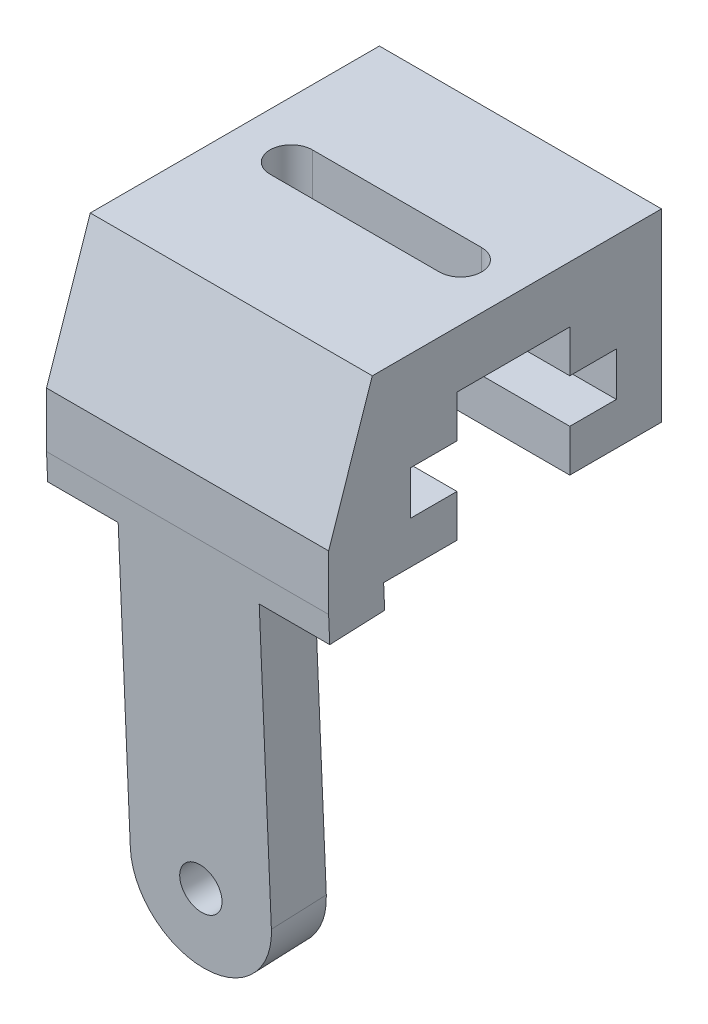
ISO-10303-21;
HEADER;
FILE_DESCRIPTION(('STEP AP214'),'2;1');
FILE_NAME('part.step','',(''),(''),'','','');
FILE_SCHEMA(('AUTOMOTIVE_DESIGN { 1 0 10303 214 1 1 1 1 }'));
ENDSEC;
DATA;
#1=APPLICATION_CONTEXT('core data for automotive mechanical design processes');
#2=APPLICATION_PROTOCOL_DEFINITION('international standard','automotive_design',2000,#1);
#3=PRODUCT_CONTEXT('',#1,'mechanical');
#4=PRODUCT('Part','Part','',(#3));
#5=PRODUCT_RELATED_PRODUCT_CATEGORY('part','',(#4));
#6=PRODUCT_DEFINITION_FORMATION('','',#4);
#7=PRODUCT_DEFINITION_CONTEXT('part definition',#1,'design');
#8=PRODUCT_DEFINITION('design','',#6,#7);
#9=PRODUCT_DEFINITION_SHAPE('','',#8);
#10=(LENGTH_UNIT() NAMED_UNIT(*) SI_UNIT(.MILLI.,.METRE.));
#11=(NAMED_UNIT(*) PLANE_ANGLE_UNIT() SI_UNIT($,.RADIAN.));
#12=(NAMED_UNIT(*) SI_UNIT($,.STERADIAN.) SOLID_ANGLE_UNIT());
#13=UNCERTAINTY_MEASURE_WITH_UNIT(LENGTH_MEASURE(1.E-05),#10,'distance_accuracy_value','');
#14=(GEOMETRIC_REPRESENTATION_CONTEXT(3) GLOBAL_UNCERTAINTY_ASSIGNED_CONTEXT((#13)) GLOBAL_UNIT_ASSIGNED_CONTEXT((#10,
#11,#12)) REPRESENTATION_CONTEXT('',''));
#15=CARTESIAN_POINT('',(0.,0.,0.));
#16=DIRECTION('',(0.,0.,1.));
#17=DIRECTION('',(1.,0.,0.));
#18=AXIS2_PLACEMENT_3D('',#15,#16,#17);
#19=CARTESIAN_POINT('',(10.,0.0103965592488447,-0.246061748106842));
#20=DIRECTION('',(0.,0.0422141664742495,-0.999108584763881));
#21=DIRECTION('',(0.,0.999108584763881,0.0422141664742495));
#22=AXIS2_PLACEMENT_3D('',#19,#20,#21);
#23=PLANE('',#22);
#24=CARTESIAN_POINT('',(0.,-35.2399685853006,-1.73545419771908));
#25=DIRECTION('',(0.,0.0422141664742495,-0.999108584763881));
#26=DIRECTION('',(0.,0.999108584763881,0.0422141664742495));
#27=AXIS2_PLACEMENT_3D('',#24,#25,#26);
#28=CIRCLE('',#27,5.);
#29=CARTESIAN_POINT('',(5.,-35.2399685853006,-1.73545419771908));
#30=VERTEX_POINT('',#29);
#31=CARTESIAN_POINT('',(0.,-40.23551150912,-1.94652503009033));
#32=VERTEX_POINT('',#31);
#33=EDGE_CURVE('E289',#30,#32,#28,.T.);
#34=ORIENTED_EDGE('',*,*,#33,.T.);
#35=CARTESIAN_POINT('',(0.,-35.2399685853006,-1.73545419771908));
#36=DIRECTION('',(0.,0.0422141664742495,-0.999108584763881));
#37=DIRECTION('',(0.,0.999108584763881,0.0422141664742495));
#38=AXIS2_PLACEMENT_3D('',#35,#36,#37);
#39=CIRCLE('',#38,5.);
#40=CARTESIAN_POINT('',(-5.,-35.2399685853006,-1.73545419771908));
#41=VERTEX_POINT('',#40);
#42=EDGE_CURVE('E44',#32,#41,#39,.T.);
#43=ORIENTED_EDGE('',*,*,#42,.T.);
#44=DIRECTION('',(0.,-0.999108584763881,-0.0422141664742495));
#45=VECTOR('',#44,1.);
#46=CARTESIAN_POINT('',(-5.,0.0103965592488447,-0.246061748106842));
#47=LINE('',#46,#45);
#48=CARTESIAN_POINT('',(-5.,-14.83551150912,-0.873328537939938));
#49=VERTEX_POINT('',#48);
#50=EDGE_CURVE('E292',#49,#41,#47,.T.);
#51=ORIENTED_EDGE('',*,*,#50,.F.);
#52=DIRECTION('',(-1.,0.,0.));
#53=VECTOR('',#52,1.);
#54=CARTESIAN_POINT('',(10.,-14.83551150912,-0.873328537939938));
#55=LINE('',#54,#53);
#56=CARTESIAN_POINT('',(-10.,-14.83551150912,-0.873328537939938));
#57=VERTEX_POINT('',#56);
#58=EDGE_CURVE('E326',#49,#57,#55,.T.);
#59=ORIENTED_EDGE('',*,*,#58,.T.);
#60=DIRECTION('',(0.,-0.999108584763881,-0.0422141664742495));
#61=VECTOR('',#60,1.);
#62=CARTESIAN_POINT('',(-10.,0.0103965592488447,-0.246061748106842));
#63=LINE('',#62,#61);
#64=CARTESIAN_POINT('',(-10.,-13.1,-0.800000000000008));
#65=VERTEX_POINT('',#64);
#66=EDGE_CURVE('E329',#65,#57,#63,.T.);
#67=ORIENTED_EDGE('',*,*,#66,.F.);
#68=DIRECTION('',(-1.,0.,0.));
#69=VECTOR('',#68,1.);
#70=CARTESIAN_POINT('',(10.,-13.1,-0.800000000000008));
#71=LINE('',#70,#69);
#72=CARTESIAN_POINT('',(10.,-13.1,-0.800000000000008));
#73=VERTEX_POINT('',#72);
#74=EDGE_CURVE('E332',#73,#65,#71,.T.);
#75=ORIENTED_EDGE('',*,*,#74,.F.);
#76=DIRECTION('',(0.,-0.999108584763881,-0.0422141664742495));
#77=VECTOR('',#76,1.);
#78=CARTESIAN_POINT('',(10.,0.0103965592488447,-0.246061748106842));
#79=LINE('',#78,#77);
#80=CARTESIAN_POINT('',(10.,-14.83551150912,-0.873328537939938));
#81=VERTEX_POINT('',#80);
#82=EDGE_CURVE('E542',#73,#81,#79,.T.);
#83=ORIENTED_EDGE('',*,*,#82,.T.);
#84=CARTESIAN_POINT('',(5.,-14.83551150912,-0.873328537939938));
#85=VERTEX_POINT('',#84);
#86=EDGE_CURVE('E319',#81,#85,#55,.T.);
#87=ORIENTED_EDGE('',*,*,#86,.T.);
#88=DIRECTION('',(0.,-0.999108584763881,-0.0422141664742495));
#89=VECTOR('',#88,1.);
#90=CARTESIAN_POINT('',(5.,0.0103965592488447,-0.246061748106842));
#91=LINE('',#90,#89);
#92=EDGE_CURVE('E272',#85,#30,#91,.T.);
#93=ORIENTED_EDGE('',*,*,#92,.T.);
#94=EDGE_LOOP('',(#34,#43,#51,#59,#67,#75,#83,#87,#93));
#95=FACE_BOUND('',#94,.T.);
#96=CARTESIAN_POINT('',(0.,-35.4044570761806,-1.74240413753843));
#97=DIRECTION('',(0.,0.0422141664742495,-0.999108584763881));
#98=DIRECTION('',(0.,-0.999108584763881,-0.0422141664742495));
#99=AXIS2_PLACEMENT_3D('',#96,#97,#98);
#100=ELLIPSE('',#99,1.50133831584932,1.5);
#101=CARTESIAN_POINT('',(0.,-36.9044570761806,-1.80578188313786));
#102=VERTEX_POINT('',#101);
#103=EDGE_CURVE('E773',#102,#102,#100,.F.);
#104=ORIENTED_EDGE('',*,*,#103,.T.);
#105=EDGE_LOOP('',(#104));
#106=FACE_BOUND('',#105,.T.);
#107=ADVANCED_FACE('F35',(#95,#106),#23,.T.);
#108=CARTESIAN_POINT('',(10.,-0.154091931631145,3.64698831207381));
#109=DIRECTION('',(0.,-0.0422141664742495,0.999108584763881));
#110=DIRECTION('',(0.,-0.999108584763881,-0.0422141664742495));
#111=AXIS2_PLACEMENT_3D('',#108,#109,#110);
#112=PLANE('',#111);
#113=DIRECTION('',(0.,0.999108584763881,0.0422141664742495));
#114=VECTOR('',#113,1.);
#115=CARTESIAN_POINT('',(-5.,-0.154091931631145,3.64698831207381));
#116=LINE('',#115,#114);
#117=CARTESIAN_POINT('',(-5.,-35.4044570761806,2.15759586246157));
#118=VERTEX_POINT('',#117);
#119=CARTESIAN_POINT('',(-5.,-15.,3.01972152224072));
#120=VERTEX_POINT('',#119);
#121=EDGE_CURVE('E305',#118,#120,#116,.T.);
#122=ORIENTED_EDGE('',*,*,#121,.F.);
#123=CARTESIAN_POINT('',(0.,-35.4044570761806,2.15759586246158));
#124=DIRECTION('',(0.,-0.0422141664742495,0.999108584763881));
#125=DIRECTION('',(0.,-0.999108584763881,-0.0422141664742495));
#126=AXIS2_PLACEMENT_3D('',#123,#124,#125);
#127=CIRCLE('',#126,5.);
#128=CARTESIAN_POINT('',(0.,-40.4,1.94652503009033));
#129=VERTEX_POINT('',#128);
#130=EDGE_CURVE('E287',#118,#129,#127,.T.);
#131=ORIENTED_EDGE('',*,*,#130,.T.);
#132=CARTESIAN_POINT('',(0.,-35.4044570761806,2.15759586246158));
#133=DIRECTION('',(0.,-0.0422141664742495,0.999108584763881));
#134=DIRECTION('',(0.,-0.999108584763881,-0.0422141664742495));
#135=AXIS2_PLACEMENT_3D('',#132,#133,#134);
#136=CIRCLE('',#135,5.);
#137=CARTESIAN_POINT('',(5.,-35.4044570761806,2.15759586246157));
#138=VERTEX_POINT('',#137);
#139=EDGE_CURVE('E285',#129,#138,#136,.T.);
#140=ORIENTED_EDGE('',*,*,#139,.T.);
#141=DIRECTION('',(0.,0.999108584763881,0.0422141664742495));
#142=VECTOR('',#141,1.);
#143=CARTESIAN_POINT('',(5.,-0.154091931631145,3.64698831207381));
#144=LINE('',#143,#142);
#145=CARTESIAN_POINT('',(5.,-15.,3.01972152224072));
#146=VERTEX_POINT('',#145);
#147=EDGE_CURVE('E271',#138,#146,#144,.T.);
#148=ORIENTED_EDGE('',*,*,#147,.T.);
#149=DIRECTION('',(-1.,0.,0.));
#150=VECTOR('',#149,1.);
#151=CARTESIAN_POINT('',(10.,-15.,3.01972152224072));
#152=LINE('',#151,#150);
#153=CARTESIAN_POINT('',(10.,-15.,3.01972152224072));
#154=VERTEX_POINT('',#153);
#155=EDGE_CURVE('E403',#154,#146,#152,.T.);
#156=ORIENTED_EDGE('',*,*,#155,.F.);
#157=DIRECTION('',(0.,0.999108584763881,0.0422141664742495));
#158=VECTOR('',#157,1.);
#159=CARTESIAN_POINT('',(10.,-0.154091931631145,3.64698831207381));
#160=LINE('',#159,#158);
#161=CARTESIAN_POINT('',(10.,-13.1,3.1));
#162=VERTEX_POINT('',#161);
#163=EDGE_CURVE('E450',#154,#162,#160,.T.);
#164=ORIENTED_EDGE('',*,*,#163,.T.);
#165=DIRECTION('',(-1.,0.,0.));
#166=VECTOR('',#165,1.);
#167=CARTESIAN_POINT('',(10.,-13.1,3.1));
#168=LINE('',#167,#166);
#169=CARTESIAN_POINT('',(-10.,-13.1,3.1));
#170=VERTEX_POINT('',#169);
#171=EDGE_CURVE('E400',#162,#170,#168,.T.);
#172=ORIENTED_EDGE('',*,*,#171,.T.);
#173=DIRECTION('',(0.,0.999108584763881,0.0422141664742495));
#174=VECTOR('',#173,1.);
#175=CARTESIAN_POINT('',(-10.,-0.154091931631145,3.64698831207381));
#176=LINE('',#175,#174);
#177=CARTESIAN_POINT('',(-10.,-15.,3.01972152224072));
#178=VERTEX_POINT('',#177);
#179=EDGE_CURVE('E396',#178,#170,#176,.T.);
#180=ORIENTED_EDGE('',*,*,#179,.F.);
#181=EDGE_CURVE('E273',#120,#178,#152,.T.);
#182=ORIENTED_EDGE('',*,*,#181,.F.);
#183=EDGE_LOOP('',(#122,#131,#140,#148,#156,#164,#172,#180,#182));
#184=FACE_BOUND('',#183,.T.);
#185=CARTESIAN_POINT('',(0.,-35.4044570761806,2.15759586246157));
#186=DIRECTION('',(0.,-0.0422141664742495,0.999108584763881));
#187=DIRECTION('',(0.,-0.999108584763881,-0.0422141664742495));
#188=AXIS2_PLACEMENT_3D('',#185,#186,#187);
#189=ELLIPSE('',#188,1.50133831584932,1.5);
#190=CARTESIAN_POINT('',(0.,-36.9044570761806,2.09421811686214));
#191=VERTEX_POINT('',#190);
#192=EDGE_CURVE('E39',#191,#191,#189,.F.);
#193=ORIENTED_EDGE('',*,*,#192,.T.);
#194=EDGE_LOOP('',(#193));
#195=FACE_BOUND('',#194,.T.);
#196=ADVANCED_FACE('F447',(#184,#195),#112,.T.);
#197=CARTESIAN_POINT('',(10.,-14.8459080683689,-0.627266789833097));
#198=DIRECTION('',(0.,-0.999108584763881,-0.0422141664742496));
#199=DIRECTION('',(0.,0.0422141664742496,-0.999108584763881));
#200=AXIS2_PLACEMENT_3D('',#197,#198,#199);
#201=PLANE('',#200);
#202=ORIENTED_EDGE('',*,*,#58,.F.);
#203=DIRECTION('',(0.,-0.0422141664742496,0.999108584763881));
#204=VECTOR('',#203,1.);
#205=CARTESIAN_POINT('',(-5.,-14.8459080683689,-0.627266789833097));
#206=LINE('',#205,#204);
#207=EDGE_CURVE('E297',#49,#120,#206,.T.);
#208=ORIENTED_EDGE('',*,*,#207,.T.);
#209=ORIENTED_EDGE('',*,*,#181,.T.);
#210=DIRECTION('',(0.,-0.0422141664742496,0.999108584763881));
#211=VECTOR('',#210,1.);
#212=CARTESIAN_POINT('',(-10.,-14.8459080683689,-0.627266789833097));
#213=LINE('',#212,#211);
#214=EDGE_CURVE('E282',#57,#178,#213,.T.);
#215=ORIENTED_EDGE('',*,*,#214,.F.);
#216=EDGE_LOOP('',(#202,#208,#209,#215));
#217=FACE_BOUND('',#216,.T.);
#218=ADVANCED_FACE('F335',(#217),#201,.T.);
#219=DIRECTION('',(0.,-0.0422141664742496,0.999108584763881));
#220=VECTOR('',#219,1.);
#221=CARTESIAN_POINT('',(5.,-14.8459080683689,-0.627266789833097));
#222=LINE('',#221,#220);
#223=EDGE_CURVE('E267',#85,#146,#222,.T.);
#224=ORIENTED_EDGE('',*,*,#223,.F.);
#225=ORIENTED_EDGE('',*,*,#86,.F.);
#226=DIRECTION('',(0.,-0.0422141664742496,0.999108584763881));
#227=VECTOR('',#226,1.);
#228=CARTESIAN_POINT('',(10.,-14.8459080683689,-0.627266789833097));
#229=LINE('',#228,#227);
#230=EDGE_CURVE('E397',#81,#154,#229,.T.);
#231=ORIENTED_EDGE('',*,*,#230,.T.);
#232=ORIENTED_EDGE('',*,*,#155,.T.);
#233=EDGE_LOOP('',(#224,#225,#231,#232));
#234=FACE_BOUND('',#233,.T.);
#235=ADVANCED_FACE('F571',(#234),#201,.T.);
#236=CARTESIAN_POINT('',(10.,-13.1,0.));
#237=DIRECTION('',(0.,-1.,0.));
#238=DIRECTION('',(0.,0.,-1.));
#239=AXIS2_PLACEMENT_3D('',#236,#237,#238);
#240=PLANE('',#239);
#241=DIRECTION('',(0.,0.,1.));
#242=VECTOR('',#241,1.);
#243=CARTESIAN_POINT('',(-10.,-13.1,0.));
#244=LINE('',#243,#242);
#245=CARTESIAN_POINT('',(-10.,-13.1,-6.00000000000001));
#246=VERTEX_POINT('',#245);
#247=EDGE_CURVE('E344',#246,#65,#244,.T.);
#248=ORIENTED_EDGE('',*,*,#247,.F.);
#249=DIRECTION('',(-1.,0.,0.));
#250=VECTOR('',#249,1.);
#251=CARTESIAN_POINT('',(10.,-13.1,-6.00000000000001));
#252=LINE('',#251,#250);
#253=CARTESIAN_POINT('',(10.,-13.1,-6.00000000000001));
#254=VERTEX_POINT('',#253);
#255=EDGE_CURVE('E411',#254,#246,#252,.T.);
#256=ORIENTED_EDGE('',*,*,#255,.F.);
#257=DIRECTION('',(0.,0.,1.));
#258=VECTOR('',#257,1.);
#259=CARTESIAN_POINT('',(10.,-13.1,0.));
#260=LINE('',#259,#258);
#261=EDGE_CURVE('E540',#254,#73,#260,.T.);
#262=ORIENTED_EDGE('',*,*,#261,.T.);
#263=ORIENTED_EDGE('',*,*,#74,.T.);
#264=EDGE_LOOP('',(#248,#256,#262,#263));
#265=FACE_BOUND('',#264,.T.);
#266=ADVANCED_FACE('F539',(#265),#240,.T.);
#267=CARTESIAN_POINT('',(10.,0.,-6.00000000000002));
#268=DIRECTION('',(0.,0.,-1.));
#269=DIRECTION('',(0.,1.,0.));
#270=AXIS2_PLACEMENT_3D('',#267,#268,#269);
#271=PLANE('',#270);
#272=DIRECTION('',(0.,-1.,0.));
#273=VECTOR('',#272,1.);
#274=CARTESIAN_POINT('',(-10.,0.,-6.00000000000002));
#275=LINE('',#274,#273);
#276=CARTESIAN_POINT('',(-10.,-10.1,-6.00000000000001));
#277=VERTEX_POINT('',#276);
#278=EDGE_CURVE('E346',#277,#246,#275,.T.);
#279=ORIENTED_EDGE('',*,*,#278,.F.);
#280=DIRECTION('',(-1.,0.,0.));
#281=VECTOR('',#280,1.);
#282=CARTESIAN_POINT('',(10.,-10.1,-6.00000000000001));
#283=LINE('',#282,#281);
#284=CARTESIAN_POINT('',(10.,-10.1,-6.00000000000001));
#285=VERTEX_POINT('',#284);
#286=EDGE_CURVE('E413',#285,#277,#283,.T.);
#287=ORIENTED_EDGE('',*,*,#286,.F.);
#288=DIRECTION('',(0.,-1.,0.));
#289=VECTOR('',#288,1.);
#290=CARTESIAN_POINT('',(10.,0.,-6.00000000000002));
#291=LINE('',#290,#289);
#292=EDGE_CURVE('E535',#285,#254,#291,.T.);
#293=ORIENTED_EDGE('',*,*,#292,.T.);
#294=ORIENTED_EDGE('',*,*,#255,.T.);
#295=EDGE_LOOP('',(#279,#287,#293,#294));
#296=FACE_BOUND('',#295,.T.);
#297=ADVANCED_FACE('F534',(#296),#271,.T.);
#298=CARTESIAN_POINT('',(10.,-10.1,0.));
#299=DIRECTION('',(0.,1.,0.));
#300=DIRECTION('',(0.,0.,1.));
#301=AXIS2_PLACEMENT_3D('',#298,#299,#300);
#302=PLANE('',#301);
#303=DIRECTION('',(0.,0.,-1.));
#304=VECTOR('',#303,1.);
#305=CARTESIAN_POINT('',(-10.,-10.1,0.));
#306=LINE('',#305,#304);
#307=CARTESIAN_POINT('',(-10.,-10.1,-2.70000000000001));
#308=VERTEX_POINT('',#307);
#309=EDGE_CURVE('E351',#308,#277,#306,.T.);
#310=ORIENTED_EDGE('',*,*,#309,.F.);
#311=DIRECTION('',(-1.,0.,0.));
#312=VECTOR('',#311,1.);
#313=CARTESIAN_POINT('',(10.,-10.1,-2.70000000000001));
#314=LINE('',#313,#312);
#315=CARTESIAN_POINT('',(10.,-10.1,-2.70000000000001));
#316=VERTEX_POINT('',#315);
#317=EDGE_CURVE('E415',#316,#308,#314,.T.);
#318=ORIENTED_EDGE('',*,*,#317,.F.);
#319=DIRECTION('',(0.,0.,-1.));
#320=VECTOR('',#319,1.);
#321=CARTESIAN_POINT('',(10.,-10.1,0.));
#322=LINE('',#321,#320);
#323=EDGE_CURVE('E530',#316,#285,#322,.T.);
#324=ORIENTED_EDGE('',*,*,#323,.T.);
#325=ORIENTED_EDGE('',*,*,#286,.T.);
#326=EDGE_LOOP('',(#310,#318,#324,#325));
#327=FACE_BOUND('',#326,.T.);
#328=ADVANCED_FACE('F528',(#327),#302,.T.);
#329=CARTESIAN_POINT('',(10.,0.,-2.70000000000001));
#330=DIRECTION('',(0.,0.,-1.));
#331=DIRECTION('',(0.,1.,0.));
#332=AXIS2_PLACEMENT_3D('',#329,#330,#331);
#333=PLANE('',#332);
#334=DIRECTION('',(0.,-1.,0.));
#335=VECTOR('',#334,1.);
#336=CARTESIAN_POINT('',(-10.,0.,-2.70000000000001));
#337=LINE('',#336,#335);
#338=CARTESIAN_POINT('',(-10.,-7.,-2.70000000000001));
#339=VERTEX_POINT('',#338);
#340=EDGE_CURVE('E354',#339,#308,#337,.T.);
#341=ORIENTED_EDGE('',*,*,#340,.F.);
#342=DIRECTION('',(-1.,0.,0.));
#343=VECTOR('',#342,1.);
#344=CARTESIAN_POINT('',(10.,-7.,-2.70000000000001));
#345=LINE('',#344,#343);
#346=CARTESIAN_POINT('',(10.,-7.,-2.70000000000001));
#347=VERTEX_POINT('',#346);
#348=EDGE_CURVE('E417',#347,#339,#345,.T.);
#349=ORIENTED_EDGE('',*,*,#348,.F.);
#350=DIRECTION('',(0.,-1.,0.));
#351=VECTOR('',#350,1.);
#352=CARTESIAN_POINT('',(10.,0.,-2.70000000000001));
#353=LINE('',#352,#351);
#354=EDGE_CURVE('E524',#347,#316,#353,.T.);
#355=ORIENTED_EDGE('',*,*,#354,.T.);
#356=ORIENTED_EDGE('',*,*,#317,.T.);
#357=EDGE_LOOP('',(#341,#349,#355,#356));
#358=FACE_BOUND('',#357,.T.);
#359=ADVANCED_FACE('F521',(#358),#333,.T.);
#360=CARTESIAN_POINT('',(10.,-6.99999999999999,0.));
#361=DIRECTION('',(0.,-1.,0.));
#362=DIRECTION('',(0.,0.,-1.));
#363=AXIS2_PLACEMENT_3D('',#360,#361,#362);
#364=PLANE('',#363);
#365=DIRECTION('',(0.,0.,1.));
#366=VECTOR('',#365,1.);
#367=CARTESIAN_POINT('',(-10.,-6.99999999999999,0.));
#368=LINE('',#367,#366);
#369=CARTESIAN_POINT('',(-10.,-7.,-6.00000000000001));
#370=VERTEX_POINT('',#369);
#371=EDGE_CURVE('E357',#370,#339,#368,.T.);
#372=ORIENTED_EDGE('',*,*,#371,.F.);
#373=DIRECTION('',(-1.,0.,0.));
#374=VECTOR('',#373,1.);
#375=CARTESIAN_POINT('',(10.,-7.,-6.00000000000001));
#376=LINE('',#375,#374);
#377=CARTESIAN_POINT('',(10.,-7.,-6.00000000000001));
#378=VERTEX_POINT('',#377);
#379=EDGE_CURVE('E419',#378,#370,#376,.T.);
#380=ORIENTED_EDGE('',*,*,#379,.F.);
#381=DIRECTION('',(0.,0.,1.));
#382=VECTOR('',#381,1.);
#383=CARTESIAN_POINT('',(10.,-6.99999999999999,0.));
#384=LINE('',#383,#382);
#385=EDGE_CURVE('E553',#378,#347,#384,.T.);
#386=ORIENTED_EDGE('',*,*,#385,.T.);
#387=ORIENTED_EDGE('',*,*,#348,.T.);
#388=EDGE_LOOP('',(#372,#380,#386,#387));
#389=FACE_BOUND('',#388,.T.);
#390=ADVANCED_FACE('F517',(#389),#364,.T.);
#391=CARTESIAN_POINT('',(10.,0.,-6.00000000000001));
#392=DIRECTION('',(0.,0.,-1.));
#393=DIRECTION('',(-1.,0.,0.));
#394=AXIS2_PLACEMENT_3D('',#391,#392,#393);
#395=PLANE('',#394);
#396=DIRECTION('',(0.,-1.,0.));
#397=VECTOR('',#396,1.);
#398=CARTESIAN_POINT('',(-10.,0.,-6.00000000000001));
#399=LINE('',#398,#397);
#400=CARTESIAN_POINT('',(-10.,-4.,-6.00000000000001));
#401=VERTEX_POINT('',#400);
#402=EDGE_CURVE('E360',#401,#370,#399,.T.);
#403=ORIENTED_EDGE('',*,*,#402,.F.);
#404=DIRECTION('',(-1.,0.,0.));
#405=VECTOR('',#404,1.);
#406=CARTESIAN_POINT('',(10.,-4.,-6.00000000000001));
#407=LINE('',#406,#405);
#408=CARTESIAN_POINT('',(10.,-4.,-6.00000000000001));
#409=VERTEX_POINT('',#408);
#410=EDGE_CURVE('E421',#409,#401,#407,.T.);
#411=ORIENTED_EDGE('',*,*,#410,.F.);
#412=DIRECTION('',(0.,-1.,0.));
#413=VECTOR('',#412,1.);
#414=CARTESIAN_POINT('',(10.,0.,-6.00000000000001));
#415=LINE('',#414,#413);
#416=EDGE_CURVE('E513',#409,#378,#415,.T.);
#417=ORIENTED_EDGE('',*,*,#416,.T.);
#418=ORIENTED_EDGE('',*,*,#379,.T.);
#419=EDGE_LOOP('',(#403,#411,#417,#418));
#420=FACE_BOUND('',#419,.T.);
#421=ADVANCED_FACE('F511',(#420),#395,.T.);
#422=CARTESIAN_POINT('',(10.,-4.,0.));
#423=DIRECTION('',(0.,-1.,0.));
#424=DIRECTION('',(0.,0.,-1.));
#425=AXIS2_PLACEMENT_3D('',#422,#423,#424);
#426=PLANE('',#425);
#427=CARTESIAN_POINT('',(-6.,-4.,-10.25));
#428=DIRECTION('',(0.,-1.,0.));
#429=DIRECTION('',(0.,0.,-1.));
#430=AXIS2_PLACEMENT_3D('',#427,#428,#429);
#431=CIRCLE('',#430,1.5);
#432=CARTESIAN_POINT('',(-6.,-4.,-11.75));
#433=VERTEX_POINT('',#432);
#434=CARTESIAN_POINT('',(-6.,-4.,-8.75));
#435=VERTEX_POINT('',#434);
#436=EDGE_CURVE('E237',#433,#435,#431,.F.);
#437=ORIENTED_EDGE('',*,*,#436,.T.);
#438=DIRECTION('',(1.,0.,0.));
#439=VECTOR('',#438,1.);
#440=CARTESIAN_POINT('',(-6.,-4.,-8.75));
#441=LINE('',#440,#439);
#442=CARTESIAN_POINT('',(6.,-4.,-8.75));
#443=VERTEX_POINT('',#442);
#444=EDGE_CURVE('E226',#435,#443,#441,.T.);
#445=ORIENTED_EDGE('',*,*,#444,.T.);
#446=CARTESIAN_POINT('',(6.,-4.,-10.25));
#447=DIRECTION('',(0.,-1.,0.));
#448=DIRECTION('',(0.,0.,-1.));
#449=AXIS2_PLACEMENT_3D('',#446,#447,#448);
#450=CIRCLE('',#449,1.5);
#451=CARTESIAN_POINT('',(6.,-4.,-11.75));
#452=VERTEX_POINT('',#451);
#453=EDGE_CURVE('E248',#443,#452,#450,.F.);
#454=ORIENTED_EDGE('',*,*,#453,.T.);
#455=DIRECTION('',(-1.,0.,0.));
#456=VECTOR('',#455,1.);
#457=CARTESIAN_POINT('',(-6.,-4.,-11.75));
#458=LINE('',#457,#456);
#459=EDGE_CURVE('E244',#452,#433,#458,.T.);
#460=ORIENTED_EDGE('',*,*,#459,.T.);
#461=EDGE_LOOP('',(#437,#445,#454,#460));
#462=FACE_BOUND('',#461,.T.);
#463=DIRECTION('',(0.,0.,1.));
#464=VECTOR('',#463,1.);
#465=CARTESIAN_POINT('',(-10.,-4.,0.));
#466=LINE('',#465,#464);
#467=CARTESIAN_POINT('',(-10.,-4.,-14.));
#468=VERTEX_POINT('',#467);
#469=EDGE_CURVE('E363',#468,#401,#466,.T.);
#470=ORIENTED_EDGE('',*,*,#469,.F.);
#471=DIRECTION('',(-1.,0.,0.));
#472=VECTOR('',#471,1.);
#473=CARTESIAN_POINT('',(10.,-4.,-14.));
#474=LINE('',#473,#472);
#475=CARTESIAN_POINT('',(10.,-4.,-14.));
#476=VERTEX_POINT('',#475);
#477=EDGE_CURVE('E423',#476,#468,#474,.T.);
#478=ORIENTED_EDGE('',*,*,#477,.F.);
#479=DIRECTION('',(0.,0.,1.));
#480=VECTOR('',#479,1.);
#481=CARTESIAN_POINT('',(10.,-4.,0.));
#482=LINE('',#481,#480);
#483=EDGE_CURVE('E507',#476,#409,#482,.T.);
#484=ORIENTED_EDGE('',*,*,#483,.T.);
#485=ORIENTED_EDGE('',*,*,#410,.T.);
#486=EDGE_LOOP('',(#470,#478,#484,#485));
#487=FACE_BOUND('',#486,.T.);
#488=ADVANCED_FACE('F242',(#462,#487),#426,.T.);
#489=CARTESIAN_POINT('',(10.,0.,-14.));
#490=DIRECTION('',(0.,0.,1.));
#491=DIRECTION('',(0.,-1.,0.));
#492=AXIS2_PLACEMENT_3D('',#489,#490,#491);
#493=PLANE('',#492);
#494=DIRECTION('',(0.,1.,0.));
#495=VECTOR('',#494,1.);
#496=CARTESIAN_POINT('',(-10.,0.,-14.));
#497=LINE('',#496,#495);
#498=CARTESIAN_POINT('',(-10.,-7.,-14.));
#499=VERTEX_POINT('',#498);
#500=EDGE_CURVE('E366',#499,#468,#497,.T.);
#501=ORIENTED_EDGE('',*,*,#500,.F.);
#502=DIRECTION('',(-1.,0.,0.));
#503=VECTOR('',#502,1.);
#504=CARTESIAN_POINT('',(10.,-7.,-14.));
#505=LINE('',#504,#503);
#506=CARTESIAN_POINT('',(10.,-7.,-14.));
#507=VERTEX_POINT('',#506);
#508=EDGE_CURVE('E425',#507,#499,#505,.T.);
#509=ORIENTED_EDGE('',*,*,#508,.F.);
#510=DIRECTION('',(0.,1.,0.));
#511=VECTOR('',#510,1.);
#512=CARTESIAN_POINT('',(10.,0.,-14.));
#513=LINE('',#512,#511);
#514=EDGE_CURVE('E557',#507,#476,#513,.T.);
#515=ORIENTED_EDGE('',*,*,#514,.T.);
#516=ORIENTED_EDGE('',*,*,#477,.T.);
#517=EDGE_LOOP('',(#501,#509,#515,#516));
#518=FACE_BOUND('',#517,.T.);
#519=ADVANCED_FACE('F502',(#518),#493,.T.);
#520=CARTESIAN_POINT('',(10.,-7.,0.));
#521=DIRECTION('',(0.,-1.,0.));
#522=DIRECTION('',(0.,0.,-1.));
#523=AXIS2_PLACEMENT_3D('',#520,#521,#522);
#524=PLANE('',#523);
#525=DIRECTION('',(0.,0.,1.));
#526=VECTOR('',#525,1.);
#527=CARTESIAN_POINT('',(-10.,-7.,0.));
#528=LINE('',#527,#526);
#529=CARTESIAN_POINT('',(-10.,-6.99999999999999,-17.3));
#530=VERTEX_POINT('',#529);
#531=EDGE_CURVE('E369',#530,#499,#528,.T.);
#532=ORIENTED_EDGE('',*,*,#531,.F.);
#533=DIRECTION('',(-1.,0.,0.));
#534=VECTOR('',#533,1.);
#535=CARTESIAN_POINT('',(10.,-6.99999999999999,-17.3));
#536=LINE('',#535,#534);
#537=CARTESIAN_POINT('',(10.,-6.99999999999999,-17.3));
#538=VERTEX_POINT('',#537);
#539=EDGE_CURVE('E427',#538,#530,#536,.T.);
#540=ORIENTED_EDGE('',*,*,#539,.F.);
#541=DIRECTION('',(0.,0.,1.));
#542=VECTOR('',#541,1.);
#543=CARTESIAN_POINT('',(10.,-7.,0.));
#544=LINE('',#543,#542);
#545=EDGE_CURVE('E498',#538,#507,#544,.T.);
#546=ORIENTED_EDGE('',*,*,#545,.T.);
#547=ORIENTED_EDGE('',*,*,#508,.T.);
#548=EDGE_LOOP('',(#532,#540,#546,#547));
#549=FACE_BOUND('',#548,.T.);
#550=ADVANCED_FACE('F496',(#549),#524,.T.);
#551=CARTESIAN_POINT('',(10.,0.,-17.3));
#552=DIRECTION('',(0.,0.,1.));
#553=DIRECTION('',(1.,0.,0.));
#554=AXIS2_PLACEMENT_3D('',#551,#552,#553);
#555=PLANE('',#554);
#556=DIRECTION('',(0.,1.,0.));
#557=VECTOR('',#556,1.);
#558=CARTESIAN_POINT('',(-10.,0.,-17.3));
#559=LINE('',#558,#557);
#560=CARTESIAN_POINT('',(-10.,-10.1,-17.3));
#561=VERTEX_POINT('',#560);
#562=EDGE_CURVE('E372',#561,#530,#559,.T.);
#563=ORIENTED_EDGE('',*,*,#562,.F.);
#564=DIRECTION('',(-1.,0.,0.));
#565=VECTOR('',#564,1.);
#566=CARTESIAN_POINT('',(10.,-10.1,-17.3));
#567=LINE('',#566,#565);
#568=CARTESIAN_POINT('',(10.,-10.1,-17.3));
#569=VERTEX_POINT('',#568);
#570=EDGE_CURVE('E429',#569,#561,#567,.T.);
#571=ORIENTED_EDGE('',*,*,#570,.F.);
#572=DIRECTION('',(0.,1.,0.));
#573=VECTOR('',#572,1.);
#574=CARTESIAN_POINT('',(10.,0.,-17.3));
#575=LINE('',#574,#573);
#576=EDGE_CURVE('E492',#569,#538,#575,.T.);
#577=ORIENTED_EDGE('',*,*,#576,.T.);
#578=ORIENTED_EDGE('',*,*,#539,.T.);
#579=EDGE_LOOP('',(#563,#571,#577,#578));
#580=FACE_BOUND('',#579,.T.);
#581=ADVANCED_FACE('F489',(#580),#555,.T.);
#582=CARTESIAN_POINT('',(10.,-10.1,0.));
#583=DIRECTION('',(0.,1.,0.));
#584=DIRECTION('',(0.,0.,1.));
#585=AXIS2_PLACEMENT_3D('',#582,#583,#584);
#586=PLANE('',#585);
#587=DIRECTION('',(0.,0.,-1.));
#588=VECTOR('',#587,1.);
#589=CARTESIAN_POINT('',(-10.,-10.1,0.));
#590=LINE('',#589,#588);
#591=CARTESIAN_POINT('',(-10.,-10.1,-14.));
#592=VERTEX_POINT('',#591);
#593=EDGE_CURVE('E375',#592,#561,#590,.T.);
#594=ORIENTED_EDGE('',*,*,#593,.F.);
#595=DIRECTION('',(-1.,0.,0.));
#596=VECTOR('',#595,1.);
#597=CARTESIAN_POINT('',(10.,-10.1,-14.));
#598=LINE('',#597,#596);
#599=CARTESIAN_POINT('',(10.,-10.1,-14.));
#600=VERTEX_POINT('',#599);
#601=EDGE_CURVE('E431',#600,#592,#598,.T.);
#602=ORIENTED_EDGE('',*,*,#601,.F.);
#603=DIRECTION('',(0.,0.,-1.));
#604=VECTOR('',#603,1.);
#605=CARTESIAN_POINT('',(10.,-10.1,0.));
#606=LINE('',#605,#604);
#607=EDGE_CURVE('E561',#600,#569,#606,.T.);
#608=ORIENTED_EDGE('',*,*,#607,.T.);
#609=ORIENTED_EDGE('',*,*,#570,.T.);
#610=EDGE_LOOP('',(#594,#602,#608,#609));
#611=FACE_BOUND('',#610,.T.);
#612=ADVANCED_FACE('F485',(#611),#586,.T.);
#613=CARTESIAN_POINT('',(10.,0.,-14.));
#614=DIRECTION('',(0.,0.,1.));
#615=DIRECTION('',(0.,-1.,0.));
#616=AXIS2_PLACEMENT_3D('',#613,#614,#615);
#617=PLANE('',#616);
#618=DIRECTION('',(0.,1.,0.));
#619=VECTOR('',#618,1.);
#620=CARTESIAN_POINT('',(-10.,0.,-14.));
#621=LINE('',#620,#619);
#622=CARTESIAN_POINT('',(-10.,-13.1,-14.));
#623=VERTEX_POINT('',#622);
#624=EDGE_CURVE('E378',#623,#592,#621,.T.);
#625=ORIENTED_EDGE('',*,*,#624,.F.);
#626=DIRECTION('',(-1.,0.,0.));
#627=VECTOR('',#626,1.);
#628=CARTESIAN_POINT('',(10.,-13.1,-14.));
#629=LINE('',#628,#627);
#630=CARTESIAN_POINT('',(10.,-13.1,-14.));
#631=VERTEX_POINT('',#630);
#632=EDGE_CURVE('E433',#631,#623,#629,.T.);
#633=ORIENTED_EDGE('',*,*,#632,.F.);
#634=DIRECTION('',(0.,1.,0.));
#635=VECTOR('',#634,1.);
#636=CARTESIAN_POINT('',(10.,0.,-14.));
#637=LINE('',#636,#635);
#638=EDGE_CURVE('E481',#631,#600,#637,.T.);
#639=ORIENTED_EDGE('',*,*,#638,.T.);
#640=ORIENTED_EDGE('',*,*,#601,.T.);
#641=EDGE_LOOP('',(#625,#633,#639,#640));
#642=FACE_BOUND('',#641,.T.);
#643=ADVANCED_FACE('F479',(#642),#617,.T.);
#644=CARTESIAN_POINT('',(10.,-13.1,0.));
#645=DIRECTION('',(0.,-1.,0.));
#646=DIRECTION('',(0.,0.,-1.));
#647=AXIS2_PLACEMENT_3D('',#644,#645,#646);
#648=PLANE('',#647);
#649=DIRECTION('',(0.,0.,1.));
#650=VECTOR('',#649,1.);
#651=CARTESIAN_POINT('',(-10.,-13.1,0.));
#652=LINE('',#651,#650);
#653=CARTESIAN_POINT('',(-10.,-13.1,-20.5));
#654=VERTEX_POINT('',#653);
#655=EDGE_CURVE('E381',#654,#623,#652,.T.);
#656=ORIENTED_EDGE('',*,*,#655,.F.);
#657=DIRECTION('',(-1.,0.,0.));
#658=VECTOR('',#657,1.);
#659=CARTESIAN_POINT('',(10.,-13.1,-20.5));
#660=LINE('',#659,#658);
#661=CARTESIAN_POINT('',(10.,-13.1,-20.5));
#662=VERTEX_POINT('',#661);
#663=EDGE_CURVE('E435',#662,#654,#660,.T.);
#664=ORIENTED_EDGE('',*,*,#663,.F.);
#665=DIRECTION('',(0.,0.,1.));
#666=VECTOR('',#665,1.);
#667=CARTESIAN_POINT('',(10.,-13.1,0.));
#668=LINE('',#667,#666);
#669=EDGE_CURVE('E475',#662,#631,#668,.T.);
#670=ORIENTED_EDGE('',*,*,#669,.T.);
#671=ORIENTED_EDGE('',*,*,#632,.T.);
#672=EDGE_LOOP('',(#656,#664,#670,#671));
#673=FACE_BOUND('',#672,.T.);
#674=ADVANCED_FACE('F472',(#673),#648,.T.);
#675=CARTESIAN_POINT('',(10.,0.,-20.5));
#676=DIRECTION('',(0.,0.,-1.));
#677=DIRECTION('',(0.,1.,0.));
#678=AXIS2_PLACEMENT_3D('',#675,#676,#677);
#679=PLANE('',#678);
#680=DIRECTION('',(0.,-1.,0.));
#681=VECTOR('',#680,1.);
#682=CARTESIAN_POINT('',(-10.,0.,-20.5));
#683=LINE('',#682,#681);
#684=CARTESIAN_POINT('',(-10.,0.,-20.5));
#685=VERTEX_POINT('',#684);
#686=EDGE_CURVE('E384',#685,#654,#683,.T.);
#687=ORIENTED_EDGE('',*,*,#686,.F.);
#688=DIRECTION('',(-1.,0.,0.));
#689=VECTOR('',#688,1.);
#690=CARTESIAN_POINT('',(10.,0.,-20.5));
#691=LINE('',#690,#689);
#692=CARTESIAN_POINT('',(10.,0.,-20.5));
#693=VERTEX_POINT('',#692);
#694=EDGE_CURVE('E437',#693,#685,#691,.T.);
#695=ORIENTED_EDGE('',*,*,#694,.F.);
#696=DIRECTION('',(0.,-1.,0.));
#697=VECTOR('',#696,1.);
#698=CARTESIAN_POINT('',(10.,0.,-20.5));
#699=LINE('',#698,#697);
#700=EDGE_CURVE('E565',#693,#662,#699,.T.);
#701=ORIENTED_EDGE('',*,*,#700,.T.);
#702=ORIENTED_EDGE('',*,*,#663,.T.);
#703=EDGE_LOOP('',(#687,#695,#701,#702));
#704=FACE_BOUND('',#703,.T.);
#705=ADVANCED_FACE('F468',(#704),#679,.T.);
#706=CARTESIAN_POINT('',(10.,0.,0.));
#707=DIRECTION('',(0.,1.,0.));
#708=DIRECTION('',(0.,0.,1.));
#709=AXIS2_PLACEMENT_3D('',#706,#707,#708);
#710=PLANE('',#709);
#711=CARTESIAN_POINT('',(-6.,0.,-10.25));
#712=DIRECTION('',(0.,1.,0.));
#713=DIRECTION('',(0.,0.,1.));
#714=AXIS2_PLACEMENT_3D('',#711,#712,#713);
#715=CIRCLE('',#714,1.5);
#716=CARTESIAN_POINT('',(-6.,0.,-11.75));
#717=VERTEX_POINT('',#716);
#718=CARTESIAN_POINT('',(-6.,0.,-8.75));
#719=VERTEX_POINT('',#718);
#720=EDGE_CURVE('E60',#717,#719,#715,.T.);
#721=ORIENTED_EDGE('',*,*,#720,.F.);
#722=DIRECTION('',(-1.,0.,0.));
#723=VECTOR('',#722,1.);
#724=CARTESIAN_POINT('',(-6.,0.,-11.75));
#725=LINE('',#724,#723);
#726=CARTESIAN_POINT('',(6.,0.,-11.75));
#727=VERTEX_POINT('',#726);
#728=EDGE_CURVE('E239',#727,#717,#725,.T.);
#729=ORIENTED_EDGE('',*,*,#728,.F.);
#730=CARTESIAN_POINT('',(6.,0.,-10.25));
#731=DIRECTION('',(0.,1.,0.));
#732=DIRECTION('',(0.,0.,1.));
#733=AXIS2_PLACEMENT_3D('',#730,#731,#732);
#734=CIRCLE('',#733,1.5);
#735=CARTESIAN_POINT('',(6.,0.,-8.75));
#736=VERTEX_POINT('',#735);
#737=EDGE_CURVE('E253',#736,#727,#734,.T.);
#738=ORIENTED_EDGE('',*,*,#737,.F.);
#739=DIRECTION('',(1.,0.,0.));
#740=VECTOR('',#739,1.);
#741=CARTESIAN_POINT('',(-6.,0.,-8.75));
#742=LINE('',#741,#740);
#743=EDGE_CURVE('E246',#719,#736,#742,.T.);
#744=ORIENTED_EDGE('',*,*,#743,.F.);
#745=EDGE_LOOP('',(#721,#729,#738,#744));
#746=FACE_BOUND('',#745,.T.);
#747=DIRECTION('',(0.,0.,-1.));
#748=VECTOR('',#747,1.);
#749=CARTESIAN_POINT('',(-10.,0.,0.));
#750=LINE('',#749,#748);
#751=CARTESIAN_POINT('',(-10.,0.,0.));
#752=VERTEX_POINT('',#751);
#753=EDGE_CURVE('E387',#752,#685,#750,.T.);
#754=ORIENTED_EDGE('',*,*,#753,.F.);
#755=DIRECTION('',(-1.,0.,0.));
#756=VECTOR('',#755,1.);
#757=CARTESIAN_POINT('',(10.,0.,0.));
#758=LINE('',#757,#756);
#759=CARTESIAN_POINT('',(10.,0.,0.));
#760=VERTEX_POINT('',#759);
#761=EDGE_CURVE('E439',#760,#752,#758,.T.);
#762=ORIENTED_EDGE('',*,*,#761,.F.);
#763=DIRECTION('',(0.,0.,-1.));
#764=VECTOR('',#763,1.);
#765=CARTESIAN_POINT('',(10.,0.,0.));
#766=LINE('',#765,#764);
#767=EDGE_CURVE('E464',#760,#693,#766,.T.);
#768=ORIENTED_EDGE('',*,*,#767,.T.);
#769=ORIENTED_EDGE('',*,*,#694,.T.);
#770=EDGE_LOOP('',(#754,#762,#768,#769));
#771=FACE_BOUND('',#770,.T.);
#772=ADVANCED_FACE('F462',(#746,#771),#710,.T.);
#773=CARTESIAN_POINT('',(10.,0.,0.));
#774=DIRECTION('',(0.,0.319316245627255,0.947648212829273));
#775=DIRECTION('',(0.,-0.947648212829273,0.319316245627255));
#776=AXIS2_PLACEMENT_3D('',#773,#774,#775);
#777=PLANE('',#776);
#778=DIRECTION('',(0.,0.947648212829273,-0.319316245627255));
#779=VECTOR('',#778,1.);
#780=CARTESIAN_POINT('',(-10.,0.,0.));
#781=LINE('',#780,#779);
#782=CARTESIAN_POINT('',(-10.,-9.2,3.1));
#783=VERTEX_POINT('',#782);
#784=EDGE_CURVE('E390',#783,#752,#781,.T.);
#785=ORIENTED_EDGE('',*,*,#784,.F.);
#786=DIRECTION('',(-1.,0.,0.));
#787=VECTOR('',#786,1.);
#788=CARTESIAN_POINT('',(10.,-9.2,3.1));
#789=LINE('',#788,#787);
#790=CARTESIAN_POINT('',(10.,-9.2,3.1));
#791=VERTEX_POINT('',#790);
#792=EDGE_CURVE('E440',#791,#783,#789,.T.);
#793=ORIENTED_EDGE('',*,*,#792,.F.);
#794=DIRECTION('',(0.,0.947648212829273,-0.319316245627255));
#795=VECTOR('',#794,1.);
#796=CARTESIAN_POINT('',(10.,0.,0.));
#797=LINE('',#796,#795);
#798=EDGE_CURVE('E458',#791,#760,#797,.T.);
#799=ORIENTED_EDGE('',*,*,#798,.T.);
#800=ORIENTED_EDGE('',*,*,#761,.T.);
#801=EDGE_LOOP('',(#785,#793,#799,#800));
#802=FACE_BOUND('',#801,.T.);
#803=ADVANCED_FACE('F455',(#802),#777,.T.);
#804=CARTESIAN_POINT('',(10.,0.,3.1));
#805=DIRECTION('',(0.,0.,1.));
#806=DIRECTION('',(1.,0.,0.));
#807=AXIS2_PLACEMENT_3D('',#804,#805,#806);
#808=PLANE('',#807);
#809=DIRECTION('',(0.,1.,0.));
#810=VECTOR('',#809,1.);
#811=CARTESIAN_POINT('',(-10.,0.,3.1));
#812=LINE('',#811,#810);
#813=EDGE_CURVE('E393',#170,#783,#812,.T.);
#814=ORIENTED_EDGE('',*,*,#813,.F.);
#815=ORIENTED_EDGE('',*,*,#171,.F.);
#816=DIRECTION('',(0.,1.,0.));
#817=VECTOR('',#816,1.);
#818=CARTESIAN_POINT('',(10.,0.,3.1));
#819=LINE('',#818,#817);
#820=EDGE_CURVE('E569',#162,#791,#819,.T.);
#821=ORIENTED_EDGE('',*,*,#820,.T.);
#822=ORIENTED_EDGE('',*,*,#792,.T.);
#823=EDGE_LOOP('',(#814,#815,#821,#822));
#824=FACE_BOUND('',#823,.T.);
#825=ADVANCED_FACE('F452',(#824),#808,.T.);
#826=CARTESIAN_POINT('',(10.,0.,0.));
#827=DIRECTION('',(1.,0.,0.));
#828=DIRECTION('',(0.,0.,-1.));
#829=AXIS2_PLACEMENT_3D('',#826,#827,#828);
#830=PLANE('',#829);
#831=ORIENTED_EDGE('',*,*,#230,.F.);
#832=ORIENTED_EDGE('',*,*,#82,.F.);
#833=ORIENTED_EDGE('',*,*,#261,.F.);
#834=ORIENTED_EDGE('',*,*,#292,.F.);
#835=ORIENTED_EDGE('',*,*,#323,.F.);
#836=ORIENTED_EDGE('',*,*,#354,.F.);
#837=ORIENTED_EDGE('',*,*,#385,.F.);
#838=ORIENTED_EDGE('',*,*,#416,.F.);
#839=ORIENTED_EDGE('',*,*,#483,.F.);
#840=ORIENTED_EDGE('',*,*,#514,.F.);
#841=ORIENTED_EDGE('',*,*,#545,.F.);
#842=ORIENTED_EDGE('',*,*,#576,.F.);
#843=ORIENTED_EDGE('',*,*,#607,.F.);
#844=ORIENTED_EDGE('',*,*,#638,.F.);
#845=ORIENTED_EDGE('',*,*,#669,.F.);
#846=ORIENTED_EDGE('',*,*,#700,.F.);
#847=ORIENTED_EDGE('',*,*,#767,.F.);
#848=ORIENTED_EDGE('',*,*,#798,.F.);
#849=ORIENTED_EDGE('',*,*,#820,.F.);
#850=ORIENTED_EDGE('',*,*,#163,.F.);
#851=EDGE_LOOP('',(#831,#832,#833,#834,#835,#836,#837,#838,#839,#840,#841,#842,#843,#844,#845,
#846,#847,#848,#849,#850));
#852=FACE_BOUND('',#851,.T.);
#853=ADVANCED_FACE('F545',(#852),#830,.T.);
#854=CARTESIAN_POINT('',(-10.,0.,0.));
#855=DIRECTION('',(1.,0.,0.));
#856=DIRECTION('',(0.,0.,-1.));
#857=AXIS2_PLACEMENT_3D('',#854,#855,#856);
#858=PLANE('',#857);
#859=ORIENTED_EDGE('',*,*,#214,.T.);
#860=ORIENTED_EDGE('',*,*,#179,.T.);
#861=ORIENTED_EDGE('',*,*,#813,.T.);
#862=ORIENTED_EDGE('',*,*,#784,.T.);
#863=ORIENTED_EDGE('',*,*,#753,.T.);
#864=ORIENTED_EDGE('',*,*,#686,.T.);
#865=ORIENTED_EDGE('',*,*,#655,.T.);
#866=ORIENTED_EDGE('',*,*,#624,.T.);
#867=ORIENTED_EDGE('',*,*,#593,.T.);
#868=ORIENTED_EDGE('',*,*,#562,.T.);
#869=ORIENTED_EDGE('',*,*,#531,.T.);
#870=ORIENTED_EDGE('',*,*,#500,.T.);
#871=ORIENTED_EDGE('',*,*,#469,.T.);
#872=ORIENTED_EDGE('',*,*,#402,.T.);
#873=ORIENTED_EDGE('',*,*,#371,.T.);
#874=ORIENTED_EDGE('',*,*,#340,.T.);
#875=ORIENTED_EDGE('',*,*,#309,.T.);
#876=ORIENTED_EDGE('',*,*,#278,.T.);
#877=ORIENTED_EDGE('',*,*,#247,.T.);
#878=ORIENTED_EDGE('',*,*,#66,.T.);
#879=EDGE_LOOP('',(#859,#860,#861,#862,#863,#864,#865,#866,#867,#868,#869,#870,#871,#872,#873,
#874,#875,#876,#877,#878));
#880=FACE_BOUND('',#879,.T.);
#881=ADVANCED_FACE('F341',(#880),#858,.F.);
#882=CARTESIAN_POINT('',(5.,0.,0.));
#883=DIRECTION('',(1.,0.,0.));
#884=DIRECTION('',(0.,0.,-1.));
#885=AXIS2_PLACEMENT_3D('',#882,#883,#884);
#886=PLANE('',#885);
#887=ORIENTED_EDGE('',*,*,#147,.F.);
#888=DIRECTION('',(0.,-0.0422141664742505,0.999108584763881));
#889=VECTOR('',#888,1.);
#890=CARTESIAN_POINT('',(5.,-35.2503651445494,-1.48939244961227));
#891=LINE('',#890,#889);
#892=EDGE_CURVE('E11',#138,#30,#891,.F.);
#893=ORIENTED_EDGE('',*,*,#892,.T.);
#894=ORIENTED_EDGE('',*,*,#92,.F.);
#895=ORIENTED_EDGE('',*,*,#223,.T.);
#896=EDGE_LOOP('',(#887,#893,#894,#895));
#897=FACE_BOUND('',#896,.T.);
#898=ADVANCED_FACE('F574',(#897),#886,.T.);
#899=CARTESIAN_POINT('',(-5.,0.,0.));
#900=DIRECTION('',(1.,0.,0.));
#901=DIRECTION('',(0.,0.,-1.));
#902=AXIS2_PLACEMENT_3D('',#899,#900,#901);
#903=PLANE('',#902);
#904=ORIENTED_EDGE('',*,*,#50,.T.);
#905=DIRECTION('',(0.,-0.0422141664742505,0.999108584763881));
#906=VECTOR('',#905,1.);
#907=CARTESIAN_POINT('',(-5.,-35.4044570761806,2.15759586246158));
#908=LINE('',#907,#906);
#909=EDGE_CURVE('E283',#41,#118,#908,.T.);
#910=ORIENTED_EDGE('',*,*,#909,.T.);
#911=ORIENTED_EDGE('',*,*,#121,.T.);
#912=ORIENTED_EDGE('',*,*,#207,.F.);
#913=EDGE_LOOP('',(#904,#910,#911,#912));
#914=FACE_BOUND('',#913,.T.);
#915=ADVANCED_FACE('F572',(#914),#903,.F.);
#916=CARTESIAN_POINT('',(0.,-35.2503651445494,-1.48939244961227));
#917=DIRECTION('',(0.,-0.0422141664742505,0.999108584763881));
#918=DIRECTION('',(0.,-0.999108584763881,-0.0422141664742505));
#919=AXIS2_PLACEMENT_3D('',#916,#917,#918);
#920=CYLINDRICAL_SURFACE('',#919,5.);
#921=DIRECTION('',(0.,-0.0422141664742505,0.999108584763881));
#922=VECTOR('',#921,1.);
#923=CARTESIAN_POINT('',(0.,-40.2459080683688,-1.70046328198352));
#924=LINE('',#923,#922);
#925=EDGE_CURVE('E233',#32,#129,#924,.T.);
#926=ORIENTED_EDGE('',*,*,#925,.F.);
#927=ORIENTED_EDGE('',*,*,#33,.F.);
#928=ORIENTED_EDGE('',*,*,#892,.F.);
#929=ORIENTED_EDGE('',*,*,#139,.F.);
#930=EDGE_LOOP('',(#926,#927,#928,#929));
#931=FACE_BOUND('',#930,.T.);
#932=ADVANCED_FACE('F37',(#931),#920,.T.);
#933=CARTESIAN_POINT('',(0.,-35.2503651445494,-1.48939244961227));
#934=DIRECTION('',(0.,0.0422141664742505,-0.999108584763881));
#935=DIRECTION('',(0.,0.999108584763881,0.0422141664742505));
#936=AXIS2_PLACEMENT_3D('',#933,#934,#935);
#937=CYLINDRICAL_SURFACE('',#936,5.);
#938=ORIENTED_EDGE('',*,*,#42,.F.);
#939=ORIENTED_EDGE('',*,*,#925,.T.);
#940=ORIENTED_EDGE('',*,*,#130,.F.);
#941=ORIENTED_EDGE('',*,*,#909,.F.);
#942=EDGE_LOOP('',(#938,#939,#940,#941));
#943=FACE_BOUND('',#942,.T.);
#944=ADVANCED_FACE('F324',(#943),#937,.T.);
#945=CARTESIAN_POINT('',(-6.,-40.401,-10.25));
#946=DIRECTION('',(0.,1.,0.));
#947=DIRECTION('',(0.,0.,1.));
#948=AXIS2_PLACEMENT_3D('',#945,#946,#947);
#949=CYLINDRICAL_SURFACE('',#948,1.5);
#950=DIRECTION('',(0.,1.,0.));
#951=VECTOR('',#950,1.);
#952=CARTESIAN_POINT('',(-6.,-40.401,-11.75));
#953=LINE('',#952,#951);
#954=EDGE_CURVE('E234',#433,#717,#953,.T.);
#955=ORIENTED_EDGE('',*,*,#954,.T.);
#956=ORIENTED_EDGE('',*,*,#720,.T.);
#957=DIRECTION('',(0.,1.,0.));
#958=VECTOR('',#957,1.);
#959=CARTESIAN_POINT('',(-6.,-40.401,-8.75));
#960=LINE('',#959,#958);
#961=EDGE_CURVE('E228',#435,#719,#960,.T.);
#962=ORIENTED_EDGE('',*,*,#961,.F.);
#963=ORIENTED_EDGE('',*,*,#436,.F.);
#964=EDGE_LOOP('',(#955,#956,#962,#963));
#965=FACE_BOUND('',#964,.T.);
#966=ADVANCED_FACE('F236',(#965),#949,.F.);
#967=CARTESIAN_POINT('',(-6.,-40.401,-11.75));
#968=DIRECTION('',(0.,0.,-1.));
#969=DIRECTION('',(-1.,0.,0.));
#970=AXIS2_PLACEMENT_3D('',#967,#968,#969);
#971=PLANE('',#970);
#972=DIRECTION('',(0.,1.,0.));
#973=VECTOR('',#972,1.);
#974=CARTESIAN_POINT('',(6.,-40.401,-11.75));
#975=LINE('',#974,#973);
#976=EDGE_CURVE('E259',#452,#727,#975,.T.);
#977=ORIENTED_EDGE('',*,*,#976,.T.);
#978=ORIENTED_EDGE('',*,*,#728,.T.);
#979=ORIENTED_EDGE('',*,*,#954,.F.);
#980=ORIENTED_EDGE('',*,*,#459,.F.);
#981=EDGE_LOOP('',(#977,#978,#979,#980));
#982=FACE_BOUND('',#981,.T.);
#983=ADVANCED_FACE('F599',(#982),#971,.F.);
#984=CARTESIAN_POINT('',(6.,-40.401,-10.25));
#985=DIRECTION('',(0.,1.,0.));
#986=DIRECTION('',(0.,0.,1.));
#987=AXIS2_PLACEMENT_3D('',#984,#985,#986);
#988=CYLINDRICAL_SURFACE('',#987,1.5);
#989=DIRECTION('',(0.,1.,0.));
#990=VECTOR('',#989,1.);
#991=CARTESIAN_POINT('',(6.,-40.401,-8.75));
#992=LINE('',#991,#990);
#993=EDGE_CURVE('E52',#443,#736,#992,.T.);
#994=ORIENTED_EDGE('',*,*,#993,.T.);
#995=ORIENTED_EDGE('',*,*,#737,.T.);
#996=ORIENTED_EDGE('',*,*,#976,.F.);
#997=ORIENTED_EDGE('',*,*,#453,.F.);
#998=EDGE_LOOP('',(#994,#995,#996,#997));
#999=FACE_BOUND('',#998,.T.);
#1000=ADVANCED_FACE('F772',(#999),#988,.F.);
#1001=CARTESIAN_POINT('',(-6.,-40.401,-8.75));
#1002=DIRECTION('',(0.,0.,1.));
#1003=DIRECTION('',(1.,0.,0.));
#1004=AXIS2_PLACEMENT_3D('',#1001,#1002,#1003);
#1005=PLANE('',#1004);
#1006=ORIENTED_EDGE('',*,*,#961,.T.);
#1007=ORIENTED_EDGE('',*,*,#743,.T.);
#1008=ORIENTED_EDGE('',*,*,#993,.F.);
#1009=ORIENTED_EDGE('',*,*,#444,.F.);
#1010=EDGE_LOOP('',(#1006,#1007,#1008,#1009));
#1011=FACE_BOUND('',#1010,.T.);
#1012=ADVANCED_FACE('F227',(#1011),#1005,.F.);
#1013=CARTESIAN_POINT('',(0.,-35.4044570761806,5.));
#1014=DIRECTION('',(0.,0.,-1.));
#1015=DIRECTION('',(-1.,0.,0.));
#1016=AXIS2_PLACEMENT_3D('',#1013,#1014,#1015);
#1017=CYLINDRICAL_SURFACE('',#1016,1.5);
#1018=ORIENTED_EDGE('',*,*,#103,.F.);
#1019=EDGE_LOOP('',(#1018));
#1020=FACE_BOUND('',#1019,.T.);
#1021=ORIENTED_EDGE('',*,*,#192,.F.);
#1022=EDGE_LOOP('',(#1021));
#1023=FACE_BOUND('',#1022,.T.);
#1024=ADVANCED_FACE('F780',(#1020,#1023),#1017,.F.);
#1025=CLOSED_SHELL('',(#107,#196,#218,#235,#266,#297,#328,#359,#390,#421,#488,#519,#550,#581,
#612,#643,#674,#705,#772,#803,#825,#853,#881,#898,#915,#932,#944,#966,#983,#1000,#1012,#1024));
#1026=MANIFOLD_SOLID_BREP('B2',#1025);
#1027=ADVANCED_BREP_SHAPE_REPRESENTATION('',(#18,#1026),#14);
#1028=SHAPE_DEFINITION_REPRESENTATION(#9,#1027);
ENDSEC;
END-ISO-10303-21;
